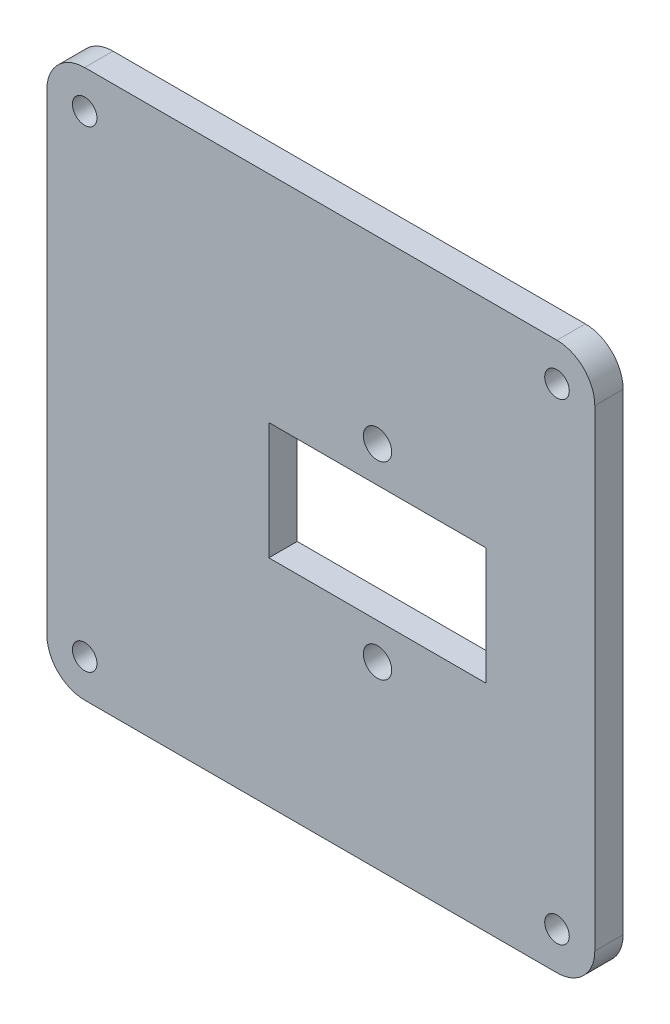
ISO-10303-21;
HEADER;
FILE_DESCRIPTION(('STEP AP214'),'2;1');
FILE_NAME('part.step','',(''),(''),'','','');
FILE_SCHEMA(('AUTOMOTIVE_DESIGN { 1 0 10303 214 1 1 1 1 }'));
ENDSEC;
DATA;
#1=APPLICATION_CONTEXT('core data for automotive mechanical design processes');
#2=APPLICATION_PROTOCOL_DEFINITION('international standard','automotive_design',2000,#1);
#3=PRODUCT_CONTEXT('',#1,'mechanical');
#4=PRODUCT('Part','Part','',(#3));
#5=PRODUCT_RELATED_PRODUCT_CATEGORY('part','',(#4));
#6=PRODUCT_DEFINITION_FORMATION('','',#4);
#7=PRODUCT_DEFINITION_CONTEXT('part definition',#1,'design');
#8=PRODUCT_DEFINITION('design','',#6,#7);
#9=PRODUCT_DEFINITION_SHAPE('','',#8);
#10=(LENGTH_UNIT() NAMED_UNIT(*) SI_UNIT(.MILLI.,.METRE.));
#11=(NAMED_UNIT(*) PLANE_ANGLE_UNIT() SI_UNIT($,.RADIAN.));
#12=(NAMED_UNIT(*) SI_UNIT($,.STERADIAN.) SOLID_ANGLE_UNIT());
#13=UNCERTAINTY_MEASURE_WITH_UNIT(LENGTH_MEASURE(1.E-05),#10,'distance_accuracy_value','');
#14=(GEOMETRIC_REPRESENTATION_CONTEXT(3) GLOBAL_UNCERTAINTY_ASSIGNED_CONTEXT((#13)) GLOBAL_UNIT_ASSIGNED_CONTEXT((#10,
#11,#12)) REPRESENTATION_CONTEXT('',''));
#15=CARTESIAN_POINT('',(0.,0.,0.));
#16=DIRECTION('',(0.,0.,1.));
#17=DIRECTION('',(1.,0.,0.));
#18=AXIS2_PLACEMENT_3D('',#15,#16,#17);
#19=CARTESIAN_POINT('',(0.,0.,3.));
#20=DIRECTION('',(0.,0.,-1.));
#21=DIRECTION('',(-1.,0.,0.));
#22=AXIS2_PLACEMENT_3D('',#19,#20,#21);
#23=PLANE('',#22);
#24=CARTESIAN_POINT('',(6.00000000000001,-9.99999999999999,3.));
#25=DIRECTION('',(0.,0.,1.));
#26=DIRECTION('',(1.,0.,0.));
#27=AXIS2_PLACEMENT_3D('',#24,#25,#26);
#28=CIRCLE('',#27,1.5);
#29=CARTESIAN_POINT('',(7.50000000000001,-9.99999999999999,3.));
#30=VERTEX_POINT('',#29);
#31=EDGE_CURVE('E494',#30,#30,#28,.T.);
#32=ORIENTED_EDGE('',*,*,#31,.F.);
#33=EDGE_LOOP('',(#32));
#34=FACE_BOUND('',#33,.T.);
#35=DIRECTION('',(-1.,0.,0.));
#36=VECTOR('',#35,1.);
#37=CARTESIAN_POINT('',(-5.49999999999998,6.19999999999999,3.));
#38=LINE('',#37,#36);
#39=CARTESIAN_POINT('',(17.5,6.20000000000001,3.));
#40=VERTEX_POINT('',#39);
#41=CARTESIAN_POINT('',(-5.49999999999998,6.19999999999999,3.));
#42=VERTEX_POINT('',#41);
#43=EDGE_CURVE('E163',#40,#42,#38,.T.);
#44=ORIENTED_EDGE('',*,*,#43,.F.);
#45=DIRECTION('',(0.,1.,0.));
#46=VECTOR('',#45,1.);
#47=CARTESIAN_POINT('',(17.5,-6.2,3.));
#48=LINE('',#47,#46);
#49=CARTESIAN_POINT('',(17.5,-6.2,3.));
#50=VERTEX_POINT('',#49);
#51=EDGE_CURVE('E133',#50,#40,#48,.T.);
#52=ORIENTED_EDGE('',*,*,#51,.F.);
#53=DIRECTION('',(1.,0.,0.));
#54=VECTOR('',#53,1.);
#55=CARTESIAN_POINT('',(-5.49999999999998,-6.20000000000001,3.));
#56=LINE('',#55,#54);
#57=CARTESIAN_POINT('',(-5.49999999999998,-6.20000000000001,3.));
#58=VERTEX_POINT('',#57);
#59=EDGE_CURVE('E151',#58,#50,#56,.T.);
#60=ORIENTED_EDGE('',*,*,#59,.F.);
#61=DIRECTION('',(0.,-1.,0.));
#62=VECTOR('',#61,1.);
#63=CARTESIAN_POINT('',(-5.49999999999998,-6.20000000000001,3.));
#64=LINE('',#63,#62);
#65=EDGE_CURVE('E154',#42,#58,#64,.T.);
#66=ORIENTED_EDGE('',*,*,#65,.F.);
#67=EDGE_LOOP('',(#44,#52,#60,#66));
#68=FACE_BOUND('',#67,.T.);
#69=CARTESIAN_POINT('',(-25.,25.,3.));
#70=DIRECTION('',(0.,0.,1.));
#71=DIRECTION('',(1.,0.,0.));
#72=AXIS2_PLACEMENT_3D('',#69,#70,#71);
#73=CIRCLE('',#72,1.3);
#74=CARTESIAN_POINT('',(-23.7,25.,3.));
#75=VERTEX_POINT('',#74);
#76=EDGE_CURVE('E169',#75,#75,#73,.T.);
#77=ORIENTED_EDGE('',*,*,#76,.F.);
#78=EDGE_LOOP('',(#77));
#79=FACE_BOUND('',#78,.T.);
#80=CARTESIAN_POINT('',(25.,25.,3.));
#81=DIRECTION('',(0.,0.,1.));
#82=DIRECTION('',(1.,0.,0.));
#83=AXIS2_PLACEMENT_3D('',#80,#81,#82);
#84=CIRCLE('',#83,1.3);
#85=CARTESIAN_POINT('',(26.3,25.,3.));
#86=VERTEX_POINT('',#85);
#87=EDGE_CURVE('E178',#86,#86,#84,.T.);
#88=ORIENTED_EDGE('',*,*,#87,.F.);
#89=EDGE_LOOP('',(#88));
#90=FACE_BOUND('',#89,.T.);
#91=CARTESIAN_POINT('',(25.,-25.,3.));
#92=DIRECTION('',(0.,0.,1.));
#93=DIRECTION('',(1.,0.,0.));
#94=AXIS2_PLACEMENT_3D('',#91,#92,#93);
#95=CIRCLE('',#94,1.3);
#96=CARTESIAN_POINT('',(26.3,-25.,3.));
#97=VERTEX_POINT('',#96);
#98=EDGE_CURVE('E184',#97,#97,#95,.T.);
#99=ORIENTED_EDGE('',*,*,#98,.F.);
#100=EDGE_LOOP('',(#99));
#101=FACE_BOUND('',#100,.T.);
#102=CARTESIAN_POINT('',(-25.,-25.,3.));
#103=DIRECTION('',(0.,0.,1.));
#104=DIRECTION('',(1.,0.,0.));
#105=AXIS2_PLACEMENT_3D('',#102,#103,#104);
#106=CIRCLE('',#105,1.3);
#107=CARTESIAN_POINT('',(-23.7,-25.,3.));
#108=VERTEX_POINT('',#107);
#109=EDGE_CURVE('E190',#108,#108,#106,.T.);
#110=ORIENTED_EDGE('',*,*,#109,.F.);
#111=EDGE_LOOP('',(#110));
#112=FACE_BOUND('',#111,.T.);
#113=DIRECTION('',(0.,-1.,0.));
#114=VECTOR('',#113,1.);
#115=CARTESIAN_POINT('',(-29.,-29.,3.));
#116=LINE('',#115,#114);
#117=CARTESIAN_POINT('',(-29.,25.,3.));
#118=VERTEX_POINT('',#117);
#119=CARTESIAN_POINT('',(-29.,-25.,3.));
#120=VERTEX_POINT('',#119);
#121=EDGE_CURVE('E202',#118,#120,#116,.T.);
#122=ORIENTED_EDGE('',*,*,#121,.T.);
#123=CARTESIAN_POINT('',(-25.,-25.,3.));
#124=DIRECTION('',(0.,0.,-1.));
#125=DIRECTION('',(-1.,0.,0.));
#126=AXIS2_PLACEMENT_3D('',#123,#124,#125);
#127=CIRCLE('',#126,4.);
#128=CARTESIAN_POINT('',(-25.,-29.,3.));
#129=VERTEX_POINT('',#128);
#130=EDGE_CURVE('E240',#120,#129,#127,.F.);
#131=ORIENTED_EDGE('',*,*,#130,.T.);
#132=DIRECTION('',(1.,0.,0.));
#133=VECTOR('',#132,1.);
#134=CARTESIAN_POINT('',(-29.,-29.,3.));
#135=LINE('',#134,#133);
#136=CARTESIAN_POINT('',(25.,-29.,3.));
#137=VERTEX_POINT('',#136);
#138=EDGE_CURVE('E205',#129,#137,#135,.T.);
#139=ORIENTED_EDGE('',*,*,#138,.T.);
#140=CARTESIAN_POINT('',(25.,-25.,3.));
#141=DIRECTION('',(0.,0.,-1.));
#142=DIRECTION('',(-1.,0.,0.));
#143=AXIS2_PLACEMENT_3D('',#140,#141,#142);
#144=CIRCLE('',#143,4.);
#145=CARTESIAN_POINT('',(29.,-25.,3.));
#146=VERTEX_POINT('',#145);
#147=EDGE_CURVE('E235',#137,#146,#144,.F.);
#148=ORIENTED_EDGE('',*,*,#147,.T.);
#149=DIRECTION('',(0.,1.,0.));
#150=VECTOR('',#149,1.);
#151=CARTESIAN_POINT('',(29.,-29.,3.));
#152=LINE('',#151,#150);
#153=CARTESIAN_POINT('',(29.,25.,3.));
#154=VERTEX_POINT('',#153);
#155=EDGE_CURVE('E197',#146,#154,#152,.T.);
#156=ORIENTED_EDGE('',*,*,#155,.T.);
#157=CARTESIAN_POINT('',(25.,25.,3.));
#158=DIRECTION('',(0.,0.,-1.));
#159=DIRECTION('',(-1.,0.,0.));
#160=AXIS2_PLACEMENT_3D('',#157,#158,#159);
#161=CIRCLE('',#160,4.);
#162=CARTESIAN_POINT('',(25.,29.,3.));
#163=VERTEX_POINT('',#162);
#164=EDGE_CURVE('E58',#154,#163,#161,.F.);
#165=ORIENTED_EDGE('',*,*,#164,.T.);
#166=DIRECTION('',(-1.,0.,0.));
#167=VECTOR('',#166,1.);
#168=CARTESIAN_POINT('',(-29.,29.,3.));
#169=LINE('',#168,#167);
#170=CARTESIAN_POINT('',(-25.,29.,3.));
#171=VERTEX_POINT('',#170);
#172=EDGE_CURVE('E199',#163,#171,#169,.T.);
#173=ORIENTED_EDGE('',*,*,#172,.T.);
#174=CARTESIAN_POINT('',(-25.,25.,3.));
#175=DIRECTION('',(0.,0.,-1.));
#176=DIRECTION('',(-1.,0.,0.));
#177=AXIS2_PLACEMENT_3D('',#174,#175,#176);
#178=CIRCLE('',#177,4.);
#179=EDGE_CURVE('E238',#171,#118,#178,.F.);
#180=ORIENTED_EDGE('',*,*,#179,.T.);
#181=EDGE_LOOP('',(#122,#131,#139,#148,#156,#165,#173,#180));
#182=FACE_BOUND('',#181,.T.);
#183=CARTESIAN_POINT('',(6.00000000000001,10.,3.));
#184=DIRECTION('',(0.,0.,1.));
#185=DIRECTION('',(1.,0.,0.));
#186=AXIS2_PLACEMENT_3D('',#183,#184,#185);
#187=CIRCLE('',#186,1.5);
#188=CARTESIAN_POINT('',(7.50000000000001,10.,3.));
#189=VERTEX_POINT('',#188);
#190=EDGE_CURVE('E497',#189,#189,#187,.T.);
#191=ORIENTED_EDGE('',*,*,#190,.F.);
#192=EDGE_LOOP('',(#191));
#193=FACE_BOUND('',#192,.T.);
#194=ADVANCED_FACE('F36',(#34,#68,#79,#90,#101,#112,#182,#193),#23,.F.);
#195=CARTESIAN_POINT('',(0.,0.,0.));
#196=DIRECTION('',(0.,0.,-1.));
#197=DIRECTION('',(-1.,0.,0.));
#198=AXIS2_PLACEMENT_3D('',#195,#196,#197);
#199=PLANE('',#198);
#200=CARTESIAN_POINT('',(6.00000000000001,10.,0.));
#201=DIRECTION('',(0.,0.,1.));
#202=DIRECTION('',(1.,0.,0.));
#203=AXIS2_PLACEMENT_3D('',#200,#201,#202);
#204=CIRCLE('',#203,1.5);
#205=CARTESIAN_POINT('',(7.50000000000001,10.,0.));
#206=VERTEX_POINT('',#205);
#207=EDGE_CURVE('E495',#206,#206,#204,.T.);
#208=ORIENTED_EDGE('',*,*,#207,.T.);
#209=EDGE_LOOP('',(#208));
#210=FACE_BOUND('',#209,.T.);
#211=CARTESIAN_POINT('',(6.00000000000001,-9.99999999999999,0.));
#212=DIRECTION('',(0.,0.,1.));
#213=DIRECTION('',(1.,0.,0.));
#214=AXIS2_PLACEMENT_3D('',#211,#212,#213);
#215=CIRCLE('',#214,1.5);
#216=CARTESIAN_POINT('',(7.50000000000001,-9.99999999999999,0.));
#217=VERTEX_POINT('',#216);
#218=EDGE_CURVE('E157',#217,#217,#215,.T.);
#219=ORIENTED_EDGE('',*,*,#218,.T.);
#220=EDGE_LOOP('',(#219));
#221=FACE_BOUND('',#220,.T.);
#222=DIRECTION('',(0.,1.,0.));
#223=VECTOR('',#222,1.);
#224=CARTESIAN_POINT('',(17.5,-6.2,0.));
#225=LINE('',#224,#223);
#226=CARTESIAN_POINT('',(17.5,-6.2,0.));
#227=VERTEX_POINT('',#226);
#228=CARTESIAN_POINT('',(17.5,6.20000000000001,0.));
#229=VERTEX_POINT('',#228);
#230=EDGE_CURVE('E130',#227,#229,#225,.T.);
#231=ORIENTED_EDGE('',*,*,#230,.T.);
#232=DIRECTION('',(-1.,0.,0.));
#233=VECTOR('',#232,1.);
#234=CARTESIAN_POINT('',(-5.49999999999998,6.19999999999999,0.));
#235=LINE('',#234,#233);
#236=CARTESIAN_POINT('',(-5.49999999999998,6.19999999999999,0.));
#237=VERTEX_POINT('',#236);
#238=EDGE_CURVE('E142',#229,#237,#235,.T.);
#239=ORIENTED_EDGE('',*,*,#238,.T.);
#240=DIRECTION('',(0.,-1.,0.));
#241=VECTOR('',#240,1.);
#242=CARTESIAN_POINT('',(-5.49999999999998,-6.20000000000001,0.));
#243=LINE('',#242,#241);
#244=CARTESIAN_POINT('',(-5.49999999999998,-6.20000000000001,0.));
#245=VERTEX_POINT('',#244);
#246=EDGE_CURVE('E146',#237,#245,#243,.T.);
#247=ORIENTED_EDGE('',*,*,#246,.T.);
#248=DIRECTION('',(1.,0.,0.));
#249=VECTOR('',#248,1.);
#250=CARTESIAN_POINT('',(-5.49999999999998,-6.20000000000001,0.));
#251=LINE('',#250,#249);
#252=EDGE_CURVE('E138',#245,#227,#251,.T.);
#253=ORIENTED_EDGE('',*,*,#252,.T.);
#254=EDGE_LOOP('',(#231,#239,#247,#253));
#255=FACE_BOUND('',#254,.T.);
#256=CARTESIAN_POINT('',(-25.,25.,0.));
#257=DIRECTION('',(0.,0.,1.));
#258=DIRECTION('',(1.,0.,0.));
#259=AXIS2_PLACEMENT_3D('',#256,#257,#258);
#260=CIRCLE('',#259,1.3);
#261=CARTESIAN_POINT('',(-23.7,25.,0.));
#262=VERTEX_POINT('',#261);
#263=EDGE_CURVE('E175',#262,#262,#260,.T.);
#264=ORIENTED_EDGE('',*,*,#263,.T.);
#265=EDGE_LOOP('',(#264));
#266=FACE_BOUND('',#265,.T.);
#267=DIRECTION('',(1.,0.,0.));
#268=VECTOR('',#267,1.);
#269=CARTESIAN_POINT('',(-29.,-29.,0.));
#270=LINE('',#269,#268);
#271=CARTESIAN_POINT('',(-25.,-29.,0.));
#272=VERTEX_POINT('',#271);
#273=CARTESIAN_POINT('',(25.,-29.,0.));
#274=VERTEX_POINT('',#273);
#275=EDGE_CURVE('E200',#272,#274,#270,.T.);
#276=ORIENTED_EDGE('',*,*,#275,.F.);
#277=CARTESIAN_POINT('',(-25.,-25.,0.));
#278=DIRECTION('',(0.,0.,-1.));
#279=DIRECTION('',(-1.,0.,0.));
#280=AXIS2_PLACEMENT_3D('',#277,#278,#279);
#281=CIRCLE('',#280,4.);
#282=CARTESIAN_POINT('',(-29.,-25.,0.));
#283=VERTEX_POINT('',#282);
#284=EDGE_CURVE('E228',#272,#283,#281,.T.);
#285=ORIENTED_EDGE('',*,*,#284,.T.);
#286=DIRECTION('',(0.,-1.,0.));
#287=VECTOR('',#286,1.);
#288=CARTESIAN_POINT('',(-29.,-29.,0.));
#289=LINE('',#288,#287);
#290=CARTESIAN_POINT('',(-29.,25.,0.));
#291=VERTEX_POINT('',#290);
#292=EDGE_CURVE('E213',#291,#283,#289,.T.);
#293=ORIENTED_EDGE('',*,*,#292,.F.);
#294=CARTESIAN_POINT('',(-25.,25.,0.));
#295=DIRECTION('',(0.,0.,-1.));
#296=DIRECTION('',(-1.,0.,0.));
#297=AXIS2_PLACEMENT_3D('',#294,#295,#296);
#298=CIRCLE('',#297,4.);
#299=CARTESIAN_POINT('',(-25.,29.,0.));
#300=VERTEX_POINT('',#299);
#301=EDGE_CURVE('E226',#291,#300,#298,.T.);
#302=ORIENTED_EDGE('',*,*,#301,.T.);
#303=DIRECTION('',(-1.,0.,0.));
#304=VECTOR('',#303,1.);
#305=CARTESIAN_POINT('',(-29.,29.,0.));
#306=LINE('',#305,#304);
#307=CARTESIAN_POINT('',(25.,29.,0.));
#308=VERTEX_POINT('',#307);
#309=EDGE_CURVE('E211',#308,#300,#306,.T.);
#310=ORIENTED_EDGE('',*,*,#309,.F.);
#311=CARTESIAN_POINT('',(25.,25.,0.));
#312=DIRECTION('',(0.,0.,-1.));
#313=DIRECTION('',(-1.,0.,0.));
#314=AXIS2_PLACEMENT_3D('',#311,#312,#313);
#315=CIRCLE('',#314,4.);
#316=CARTESIAN_POINT('',(29.,25.,0.));
#317=VERTEX_POINT('',#316);
#318=EDGE_CURVE('E224',#308,#317,#315,.T.);
#319=ORIENTED_EDGE('',*,*,#318,.T.);
#320=DIRECTION('',(0.,1.,0.));
#321=VECTOR('',#320,1.);
#322=CARTESIAN_POINT('',(29.,-29.,0.));
#323=LINE('',#322,#321);
#324=CARTESIAN_POINT('',(29.,-25.,0.));
#325=VERTEX_POINT('',#324);
#326=EDGE_CURVE('E196',#325,#317,#323,.T.);
#327=ORIENTED_EDGE('',*,*,#326,.F.);
#328=CARTESIAN_POINT('',(25.,-25.,0.));
#329=DIRECTION('',(0.,0.,-1.));
#330=DIRECTION('',(-1.,0.,0.));
#331=AXIS2_PLACEMENT_3D('',#328,#329,#330);
#332=CIRCLE('',#331,4.);
#333=EDGE_CURVE('E222',#325,#274,#332,.T.);
#334=ORIENTED_EDGE('',*,*,#333,.T.);
#335=EDGE_LOOP('',(#276,#285,#293,#302,#310,#319,#327,#334));
#336=FACE_BOUND('',#335,.T.);
#337=CARTESIAN_POINT('',(-25.,-25.,0.));
#338=DIRECTION('',(0.,0.,1.));
#339=DIRECTION('',(1.,0.,0.));
#340=AXIS2_PLACEMENT_3D('',#337,#338,#339);
#341=CIRCLE('',#340,1.3);
#342=CARTESIAN_POINT('',(-23.7,-25.,0.));
#343=VERTEX_POINT('',#342);
#344=EDGE_CURVE('E193',#343,#343,#341,.T.);
#345=ORIENTED_EDGE('',*,*,#344,.T.);
#346=EDGE_LOOP('',(#345));
#347=FACE_BOUND('',#346,.T.);
#348=CARTESIAN_POINT('',(25.,-25.,0.));
#349=DIRECTION('',(0.,0.,1.));
#350=DIRECTION('',(1.,0.,0.));
#351=AXIS2_PLACEMENT_3D('',#348,#349,#350);
#352=CIRCLE('',#351,1.3);
#353=CARTESIAN_POINT('',(26.3,-25.,0.));
#354=VERTEX_POINT('',#353);
#355=EDGE_CURVE('E187',#354,#354,#352,.T.);
#356=ORIENTED_EDGE('',*,*,#355,.T.);
#357=EDGE_LOOP('',(#356));
#358=FACE_BOUND('',#357,.T.);
#359=CARTESIAN_POINT('',(25.,25.,0.));
#360=DIRECTION('',(0.,0.,1.));
#361=DIRECTION('',(1.,0.,0.));
#362=AXIS2_PLACEMENT_3D('',#359,#360,#361);
#363=CIRCLE('',#362,1.3);
#364=CARTESIAN_POINT('',(26.3,25.,0.));
#365=VERTEX_POINT('',#364);
#366=EDGE_CURVE('E181',#365,#365,#363,.T.);
#367=ORIENTED_EDGE('',*,*,#366,.T.);
#368=EDGE_LOOP('',(#367));
#369=FACE_BOUND('',#368,.T.);
#370=ADVANCED_FACE('F148',(#210,#221,#255,#266,#336,#347,#358,#369),#199,.T.);
#371=CARTESIAN_POINT('',(29.,-29.,3.));
#372=DIRECTION('',(-1.,0.,0.));
#373=DIRECTION('',(0.,-1.,0.));
#374=AXIS2_PLACEMENT_3D('',#371,#372,#373);
#375=PLANE('',#374);
#376=ORIENTED_EDGE('',*,*,#326,.T.);
#377=DIRECTION('',(0.,0.,-1.));
#378=VECTOR('',#377,1.);
#379=CARTESIAN_POINT('',(29.,25.,3.));
#380=LINE('',#379,#378);
#381=EDGE_CURVE('E11',#317,#154,#380,.F.);
#382=ORIENTED_EDGE('',*,*,#381,.T.);
#383=ORIENTED_EDGE('',*,*,#155,.F.);
#384=DIRECTION('',(0.,0.,-1.));
#385=VECTOR('',#384,1.);
#386=CARTESIAN_POINT('',(29.,-25.,3.));
#387=LINE('',#386,#385);
#388=EDGE_CURVE('E44',#146,#325,#387,.T.);
#389=ORIENTED_EDGE('',*,*,#388,.T.);
#390=EDGE_LOOP('',(#376,#382,#383,#389));
#391=FACE_BOUND('',#390,.T.);
#392=ADVANCED_FACE('F250',(#391),#375,.F.);
#393=CARTESIAN_POINT('',(-29.,29.,3.));
#394=DIRECTION('',(0.,-1.,0.));
#395=DIRECTION('',(1.,0.,0.));
#396=AXIS2_PLACEMENT_3D('',#393,#394,#395);
#397=PLANE('',#396);
#398=ORIENTED_EDGE('',*,*,#309,.T.);
#399=DIRECTION('',(0.,0.,-1.));
#400=VECTOR('',#399,1.);
#401=CARTESIAN_POINT('',(-25.,29.,3.));
#402=LINE('',#401,#400);
#403=EDGE_CURVE('E51',#300,#171,#402,.F.);
#404=ORIENTED_EDGE('',*,*,#403,.T.);
#405=ORIENTED_EDGE('',*,*,#172,.F.);
#406=DIRECTION('',(0.,0.,-1.));
#407=VECTOR('',#406,1.);
#408=CARTESIAN_POINT('',(25.,29.,3.));
#409=LINE('',#408,#407);
#410=EDGE_CURVE('E242',#163,#308,#409,.T.);
#411=ORIENTED_EDGE('',*,*,#410,.T.);
#412=EDGE_LOOP('',(#398,#404,#405,#411));
#413=FACE_BOUND('',#412,.T.);
#414=ADVANCED_FACE('F261',(#413),#397,.F.);
#415=CARTESIAN_POINT('',(-29.,-29.,3.));
#416=DIRECTION('',(1.,0.,0.));
#417=DIRECTION('',(0.,0.,-1.));
#418=AXIS2_PLACEMENT_3D('',#415,#416,#417);
#419=PLANE('',#418);
#420=ORIENTED_EDGE('',*,*,#292,.T.);
#421=DIRECTION('',(0.,0.,-1.));
#422=VECTOR('',#421,1.);
#423=CARTESIAN_POINT('',(-29.,-25.,3.));
#424=LINE('',#423,#422);
#425=EDGE_CURVE('E233',#283,#120,#424,.F.);
#426=ORIENTED_EDGE('',*,*,#425,.T.);
#427=ORIENTED_EDGE('',*,*,#121,.F.);
#428=DIRECTION('',(0.,0.,-1.));
#429=VECTOR('',#428,1.);
#430=CARTESIAN_POINT('',(-29.,25.,3.));
#431=LINE('',#430,#429);
#432=EDGE_CURVE('E230',#118,#291,#431,.T.);
#433=ORIENTED_EDGE('',*,*,#432,.T.);
#434=EDGE_LOOP('',(#420,#426,#427,#433));
#435=FACE_BOUND('',#434,.T.);
#436=ADVANCED_FACE('F270',(#435),#419,.F.);
#437=CARTESIAN_POINT('',(-29.,-29.,3.));
#438=DIRECTION('',(0.,1.,0.));
#439=DIRECTION('',(-1.,0.,0.));
#440=AXIS2_PLACEMENT_3D('',#437,#438,#439);
#441=PLANE('',#440);
#442=ORIENTED_EDGE('',*,*,#138,.F.);
#443=DIRECTION('',(0.,0.,-1.));
#444=VECTOR('',#443,1.);
#445=CARTESIAN_POINT('',(-25.,-29.,3.));
#446=LINE('',#445,#444);
#447=EDGE_CURVE('E219',#129,#272,#446,.T.);
#448=ORIENTED_EDGE('',*,*,#447,.T.);
#449=ORIENTED_EDGE('',*,*,#275,.T.);
#450=DIRECTION('',(0.,0.,-1.));
#451=VECTOR('',#450,1.);
#452=CARTESIAN_POINT('',(25.,-29.,3.));
#453=LINE('',#452,#451);
#454=EDGE_CURVE('E208',#274,#137,#453,.F.);
#455=ORIENTED_EDGE('',*,*,#454,.T.);
#456=EDGE_LOOP('',(#442,#448,#449,#455));
#457=FACE_BOUND('',#456,.T.);
#458=ADVANCED_FACE('F278',(#457),#441,.F.);
#459=CARTESIAN_POINT('',(-25.,-25.,3.));
#460=DIRECTION('',(0.,0.,1.));
#461=DIRECTION('',(1.,0.,0.));
#462=AXIS2_PLACEMENT_3D('',#459,#460,#461);
#463=CYLINDRICAL_SURFACE('',#462,1.3);
#464=ORIENTED_EDGE('',*,*,#344,.F.);
#465=EDGE_LOOP('',(#464));
#466=FACE_BOUND('',#465,.T.);
#467=ORIENTED_EDGE('',*,*,#109,.T.);
#468=EDGE_LOOP('',(#467));
#469=FACE_BOUND('',#468,.T.);
#470=ADVANCED_FACE('F295',(#466,#469),#463,.F.);
#471=CARTESIAN_POINT('',(25.,-25.,3.));
#472=DIRECTION('',(0.,0.,1.));
#473=DIRECTION('',(1.,0.,0.));
#474=AXIS2_PLACEMENT_3D('',#471,#472,#473);
#475=CYLINDRICAL_SURFACE('',#474,1.3);
#476=ORIENTED_EDGE('',*,*,#355,.F.);
#477=EDGE_LOOP('',(#476));
#478=FACE_BOUND('',#477,.T.);
#479=ORIENTED_EDGE('',*,*,#98,.T.);
#480=EDGE_LOOP('',(#479));
#481=FACE_BOUND('',#480,.T.);
#482=ADVANCED_FACE('F409',(#478,#481),#475,.F.);
#483=CARTESIAN_POINT('',(25.,25.,3.));
#484=DIRECTION('',(0.,0.,1.));
#485=DIRECTION('',(1.,0.,0.));
#486=AXIS2_PLACEMENT_3D('',#483,#484,#485);
#487=CYLINDRICAL_SURFACE('',#486,1.3);
#488=ORIENTED_EDGE('',*,*,#366,.F.);
#489=EDGE_LOOP('',(#488));
#490=FACE_BOUND('',#489,.T.);
#491=ORIENTED_EDGE('',*,*,#87,.T.);
#492=EDGE_LOOP('',(#491));
#493=FACE_BOUND('',#492,.T.);
#494=ADVANCED_FACE('F400',(#490,#493),#487,.F.);
#495=CARTESIAN_POINT('',(-25.,25.,3.));
#496=DIRECTION('',(0.,0.,1.));
#497=DIRECTION('',(1.,0.,0.));
#498=AXIS2_PLACEMENT_3D('',#495,#496,#497);
#499=CYLINDRICAL_SURFACE('',#498,1.3);
#500=ORIENTED_EDGE('',*,*,#263,.F.);
#501=EDGE_LOOP('',(#500));
#502=FACE_BOUND('',#501,.T.);
#503=ORIENTED_EDGE('',*,*,#76,.T.);
#504=EDGE_LOOP('',(#503));
#505=FACE_BOUND('',#504,.T.);
#506=ADVANCED_FACE('F391',(#502,#505),#499,.F.);
#507=CARTESIAN_POINT('',(17.5,-6.2,0.));
#508=DIRECTION('',(1.,0.,0.));
#509=DIRECTION('',(0.,0.,-1.));
#510=AXIS2_PLACEMENT_3D('',#507,#508,#509);
#511=PLANE('',#510);
#512=ORIENTED_EDGE('',*,*,#51,.T.);
#513=DIRECTION('',(0.,0.,1.));
#514=VECTOR('',#513,1.);
#515=CARTESIAN_POINT('',(17.5,6.20000000000001,0.));
#516=LINE('',#515,#514);
#517=EDGE_CURVE('E126',#229,#40,#516,.T.);
#518=ORIENTED_EDGE('',*,*,#517,.F.);
#519=ORIENTED_EDGE('',*,*,#230,.F.);
#520=DIRECTION('',(0.,0.,1.));
#521=VECTOR('',#520,1.);
#522=CARTESIAN_POINT('',(17.5,-6.2,0.));
#523=LINE('',#522,#521);
#524=EDGE_CURVE('E167',#227,#50,#523,.T.);
#525=ORIENTED_EDGE('',*,*,#524,.T.);
#526=EDGE_LOOP('',(#512,#518,#519,#525));
#527=FACE_BOUND('',#526,.T.);
#528=ADVANCED_FACE('F128',(#527),#511,.F.);
#529=CARTESIAN_POINT('',(-5.49999999999998,-6.20000000000001,0.));
#530=DIRECTION('',(0.,-1.,0.));
#531=DIRECTION('',(1.,0.,0.));
#532=AXIS2_PLACEMENT_3D('',#529,#530,#531);
#533=PLANE('',#532);
#534=ORIENTED_EDGE('',*,*,#59,.T.);
#535=ORIENTED_EDGE('',*,*,#524,.F.);
#536=ORIENTED_EDGE('',*,*,#252,.F.);
#537=DIRECTION('',(0.,0.,1.));
#538=VECTOR('',#537,1.);
#539=CARTESIAN_POINT('',(-5.49999999999998,-6.20000000000001,0.));
#540=LINE('',#539,#538);
#541=EDGE_CURVE('E170',#245,#58,#540,.T.);
#542=ORIENTED_EDGE('',*,*,#541,.T.);
#543=EDGE_LOOP('',(#534,#535,#536,#542));
#544=FACE_BOUND('',#543,.T.);
#545=ADVANCED_FACE('F372',(#544),#533,.F.);
#546=CARTESIAN_POINT('',(-5.49999999999998,-6.20000000000001,0.));
#547=DIRECTION('',(-1.,0.,0.));
#548=DIRECTION('',(0.,0.,1.));
#549=AXIS2_PLACEMENT_3D('',#546,#547,#548);
#550=PLANE('',#549);
#551=ORIENTED_EDGE('',*,*,#65,.T.);
#552=ORIENTED_EDGE('',*,*,#541,.F.);
#553=ORIENTED_EDGE('',*,*,#246,.F.);
#554=DIRECTION('',(0.,0.,1.));
#555=VECTOR('',#554,1.);
#556=CARTESIAN_POINT('',(-5.49999999999998,6.19999999999999,0.));
#557=LINE('',#556,#555);
#558=EDGE_CURVE('E137',#237,#42,#557,.T.);
#559=ORIENTED_EDGE('',*,*,#558,.T.);
#560=EDGE_LOOP('',(#551,#552,#553,#559));
#561=FACE_BOUND('',#560,.T.);
#562=ADVANCED_FACE('F363',(#561),#550,.F.);
#563=CARTESIAN_POINT('',(-5.49999999999998,6.19999999999999,0.));
#564=DIRECTION('',(0.,1.,0.));
#565=DIRECTION('',(-1.,0.,0.));
#566=AXIS2_PLACEMENT_3D('',#563,#564,#565);
#567=PLANE('',#566);
#568=ORIENTED_EDGE('',*,*,#43,.T.);
#569=ORIENTED_EDGE('',*,*,#558,.F.);
#570=ORIENTED_EDGE('',*,*,#238,.F.);
#571=ORIENTED_EDGE('',*,*,#517,.T.);
#572=EDGE_LOOP('',(#568,#569,#570,#571));
#573=FACE_BOUND('',#572,.T.);
#574=ADVANCED_FACE('F143',(#573),#567,.F.);
#575=CARTESIAN_POINT('',(6.00000000000001,-9.99999999999999,3.));
#576=DIRECTION('',(0.,0.,1.));
#577=DIRECTION('',(1.,0.,0.));
#578=AXIS2_PLACEMENT_3D('',#575,#576,#577);
#579=CYLINDRICAL_SURFACE('',#578,1.5);
#580=ORIENTED_EDGE('',*,*,#218,.F.);
#581=EDGE_LOOP('',(#580));
#582=FACE_BOUND('',#581,.T.);
#583=ORIENTED_EDGE('',*,*,#31,.T.);
#584=EDGE_LOOP('',(#583));
#585=FACE_BOUND('',#584,.T.);
#586=ADVANCED_FACE('F339',(#582,#585),#579,.F.);
#587=CARTESIAN_POINT('',(6.00000000000001,10.,3.));
#588=DIRECTION('',(0.,0.,1.));
#589=DIRECTION('',(1.,0.,0.));
#590=AXIS2_PLACEMENT_3D('',#587,#588,#589);
#591=CYLINDRICAL_SURFACE('',#590,1.5);
#592=ORIENTED_EDGE('',*,*,#207,.F.);
#593=EDGE_LOOP('',(#592));
#594=FACE_BOUND('',#593,.T.);
#595=ORIENTED_EDGE('',*,*,#190,.T.);
#596=EDGE_LOOP('',(#595));
#597=FACE_BOUND('',#596,.T.);
#598=ADVANCED_FACE('F308',(#594,#597),#591,.F.);
#599=CARTESIAN_POINT('',(-25.,-25.,3.));
#600=DIRECTION('',(0.,0.,-1.));
#601=DIRECTION('',(-1.,0.,0.));
#602=AXIS2_PLACEMENT_3D('',#599,#600,#601);
#603=CYLINDRICAL_SURFACE('',#602,4.);
#604=ORIENTED_EDGE('',*,*,#130,.F.);
#605=ORIENTED_EDGE('',*,*,#425,.F.);
#606=ORIENTED_EDGE('',*,*,#284,.F.);
#607=ORIENTED_EDGE('',*,*,#447,.F.);
#608=EDGE_LOOP('',(#604,#605,#606,#607));
#609=FACE_BOUND('',#608,.T.);
#610=ADVANCED_FACE('F275',(#609),#603,.T.);
#611=CARTESIAN_POINT('',(-25.,25.,3.));
#612=DIRECTION('',(0.,0.,-1.));
#613=DIRECTION('',(-1.,0.,0.));
#614=AXIS2_PLACEMENT_3D('',#611,#612,#613);
#615=CYLINDRICAL_SURFACE('',#614,4.);
#616=ORIENTED_EDGE('',*,*,#179,.F.);
#617=ORIENTED_EDGE('',*,*,#403,.F.);
#618=ORIENTED_EDGE('',*,*,#301,.F.);
#619=ORIENTED_EDGE('',*,*,#432,.F.);
#620=EDGE_LOOP('',(#616,#617,#618,#619));
#621=FACE_BOUND('',#620,.T.);
#622=ADVANCED_FACE('F267',(#621),#615,.T.);
#623=CARTESIAN_POINT('',(25.,25.,3.));
#624=DIRECTION('',(0.,0.,-1.));
#625=DIRECTION('',(-1.,0.,0.));
#626=AXIS2_PLACEMENT_3D('',#623,#624,#625);
#627=CYLINDRICAL_SURFACE('',#626,4.);
#628=ORIENTED_EDGE('',*,*,#164,.F.);
#629=ORIENTED_EDGE('',*,*,#381,.F.);
#630=ORIENTED_EDGE('',*,*,#318,.F.);
#631=ORIENTED_EDGE('',*,*,#410,.F.);
#632=EDGE_LOOP('',(#628,#629,#630,#631));
#633=FACE_BOUND('',#632,.T.);
#634=ADVANCED_FACE('F260',(#633),#627,.T.);
#635=CARTESIAN_POINT('',(25.,-25.,3.));
#636=DIRECTION('',(0.,0.,-1.));
#637=DIRECTION('',(-1.,0.,0.));
#638=AXIS2_PLACEMENT_3D('',#635,#636,#637);
#639=CYLINDRICAL_SURFACE('',#638,4.);
#640=ORIENTED_EDGE('',*,*,#147,.F.);
#641=ORIENTED_EDGE('',*,*,#454,.F.);
#642=ORIENTED_EDGE('',*,*,#333,.F.);
#643=ORIENTED_EDGE('',*,*,#388,.F.);
#644=EDGE_LOOP('',(#640,#641,#642,#643));
#645=FACE_BOUND('',#644,.T.);
#646=ADVANCED_FACE('F38',(#645),#639,.T.);
#647=CLOSED_SHELL('',(#194,#370,#392,#414,#436,#458,#470,#482,#494,#506,#528,#545,#562,#574,
#586,#598,#610,#622,#634,#646));
#648=MANIFOLD_SOLID_BREP('B2',#647);
#649=ADVANCED_BREP_SHAPE_REPRESENTATION('',(#18,#648),#14);
#650=SHAPE_DEFINITION_REPRESENTATION(#9,#649);
ENDSEC;
END-ISO-10303-21;
